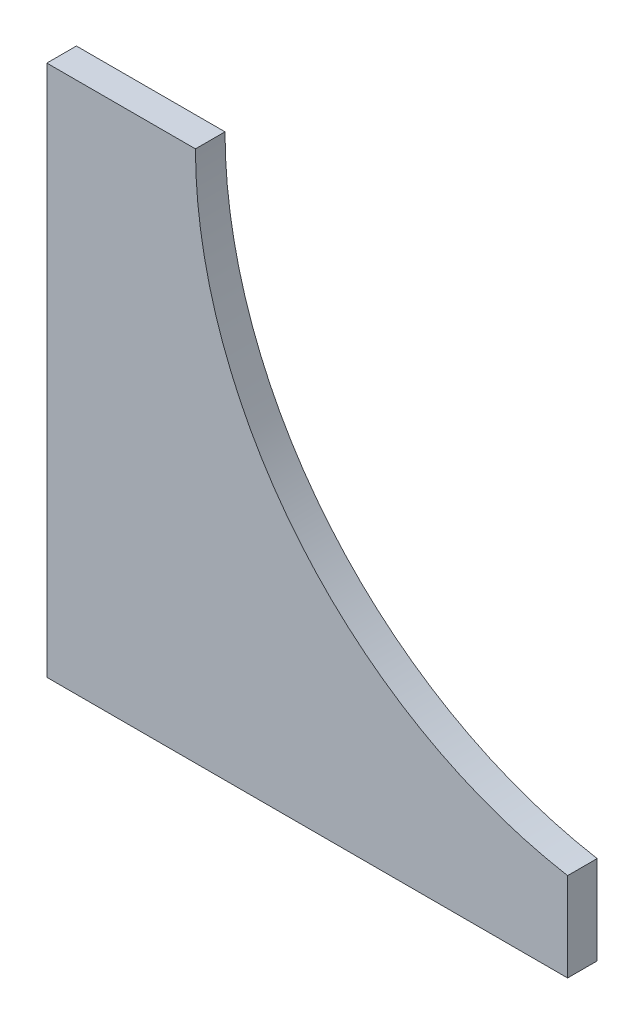
ISO-10303-21;
HEADER;
FILE_DESCRIPTION(('STEP AP214'),'2;1');
FILE_NAME('part.step','',(''),(''),'','','');
FILE_SCHEMA(('AUTOMOTIVE_DESIGN { 1 0 10303 214 1 1 1 1 }'));
ENDSEC;
DATA;
#1=APPLICATION_CONTEXT('core data for automotive mechanical design processes');
#2=APPLICATION_PROTOCOL_DEFINITION('international standard','automotive_design',2000,#1);
#3=PRODUCT_CONTEXT('',#1,'mechanical');
#4=PRODUCT('Part','Part','',(#3));
#5=PRODUCT_RELATED_PRODUCT_CATEGORY('part','',(#4));
#6=PRODUCT_DEFINITION_FORMATION('','',#4);
#7=PRODUCT_DEFINITION_CONTEXT('part definition',#1,'design');
#8=PRODUCT_DEFINITION('design','',#6,#7);
#9=PRODUCT_DEFINITION_SHAPE('','',#8);
#10=(LENGTH_UNIT() NAMED_UNIT(*) SI_UNIT(.MILLI.,.METRE.));
#11=(NAMED_UNIT(*) PLANE_ANGLE_UNIT() SI_UNIT($,.RADIAN.));
#12=(NAMED_UNIT(*) SI_UNIT($,.STERADIAN.) SOLID_ANGLE_UNIT());
#13=UNCERTAINTY_MEASURE_WITH_UNIT(LENGTH_MEASURE(1.E-05),#10,'distance_accuracy_value','');
#14=(GEOMETRIC_REPRESENTATION_CONTEXT(3) GLOBAL_UNCERTAINTY_ASSIGNED_CONTEXT((#13)) GLOBAL_UNIT_ASSIGNED_CONTEXT((#10,
#11,#12)) REPRESENTATION_CONTEXT('',''));
#15=CARTESIAN_POINT('',(0.,0.,0.));
#16=DIRECTION('',(0.,0.,1.));
#17=DIRECTION('',(1.,0.,0.));
#18=AXIS2_PLACEMENT_3D('',#15,#16,#17);
#19=CARTESIAN_POINT('',(-56.2876791796381,206.147542534489,10.));
#20=DIRECTION('',(0.,-1.,0.));
#21=DIRECTION('',(0.,0.,-1.));
#22=AXIS2_PLACEMENT_3D('',#19,#20,#21);
#23=PLANE('',#22);
#24=DIRECTION('',(-1.,0.,0.));
#25=VECTOR('',#24,1.);
#26=CARTESIAN_POINT('',(-56.2876791796381,206.147542534489,0.));
#27=LINE('',#26,#25);
#28=CARTESIAN_POINT('',(-6.00316672651846,206.147542534489,0.));
#29=VERTEX_POINT('',#28);
#30=CARTESIAN_POINT('',(-56.2876791796381,206.147542534489,0.));
#31=VERTEX_POINT('',#30);
#32=EDGE_CURVE('E107',#29,#31,#27,.T.);
#33=ORIENTED_EDGE('',*,*,#32,.T.);
#34=DIRECTION('',(0.,0.,-1.));
#35=VECTOR('',#34,1.);
#36=CARTESIAN_POINT('',(-56.2876791796381,206.147542534489,10.));
#37=LINE('',#36,#35);
#38=CARTESIAN_POINT('',(-56.2876791796381,206.147542534489,10.));
#39=VERTEX_POINT('',#38);
#40=EDGE_CURVE('E11',#39,#31,#37,.T.);
#41=ORIENTED_EDGE('',*,*,#40,.F.);
#42=DIRECTION('',(-1.,0.,0.));
#43=VECTOR('',#42,1.);
#44=CARTESIAN_POINT('',(-56.2876791796381,206.147542534489,10.));
#45=LINE('',#44,#43);
#46=CARTESIAN_POINT('',(-6.00316672651846,206.147542534489,10.));
#47=VERTEX_POINT('',#46);
#48=EDGE_CURVE('E115',#47,#39,#45,.T.);
#49=ORIENTED_EDGE('',*,*,#48,.F.);
#50=DIRECTION('',(0.,0.,-1.));
#51=VECTOR('',#50,1.);
#52=CARTESIAN_POINT('',(-6.00316672651846,206.147542534489,10.));
#53=LINE('',#52,#51);
#54=EDGE_CURVE('E103',#47,#29,#53,.T.);
#55=ORIENTED_EDGE('',*,*,#54,.T.);
#56=EDGE_LOOP('',(#33,#41,#49,#55));
#57=FACE_BOUND('',#56,.T.);
#58=ADVANCED_FACE('F33',(#57),#23,.F.);
#59=CARTESIAN_POINT('',(-56.2876791796381,206.147542534489,10.));
#60=DIRECTION('',(1.,0.,0.));
#61=DIRECTION('',(0.,1.,0.));
#62=AXIS2_PLACEMENT_3D('',#59,#60,#61);
#63=PLANE('',#62);
#64=DIRECTION('',(0.,-1.,0.));
#65=VECTOR('',#64,1.);
#66=CARTESIAN_POINT('',(-56.2876791796381,206.147542534489,0.));
#67=LINE('',#66,#65);
#68=CARTESIAN_POINT('',(-56.2876791796381,26.1475425344888,0.));
#69=VERTEX_POINT('',#68);
#70=EDGE_CURVE('E110',#31,#69,#67,.T.);
#71=ORIENTED_EDGE('',*,*,#70,.T.);
#72=DIRECTION('',(0.,0.,-1.));
#73=VECTOR('',#72,1.);
#74=CARTESIAN_POINT('',(-56.2876791796381,26.1475425344888,10.));
#75=LINE('',#74,#73);
#76=CARTESIAN_POINT('',(-56.2876791796381,26.1475425344888,10.));
#77=VERTEX_POINT('',#76);
#78=EDGE_CURVE('E41',#77,#69,#75,.T.);
#79=ORIENTED_EDGE('',*,*,#78,.F.);
#80=DIRECTION('',(0.,-1.,0.));
#81=VECTOR('',#80,1.);
#82=CARTESIAN_POINT('',(-56.2876791796381,206.147542534489,10.));
#83=LINE('',#82,#81);
#84=EDGE_CURVE('E83',#39,#77,#83,.T.);
#85=ORIENTED_EDGE('',*,*,#84,.F.);
#86=ORIENTED_EDGE('',*,*,#40,.T.);
#87=EDGE_LOOP('',(#71,#79,#85,#86));
#88=FACE_BOUND('',#87,.T.);
#89=ADVANCED_FACE('F134',(#88),#63,.F.);
#90=CARTESIAN_POINT('',(-56.2876791796381,26.1475425344888,10.));
#91=DIRECTION('',(0.,1.,0.));
#92=DIRECTION('',(0.,0.,1.));
#93=AXIS2_PLACEMENT_3D('',#90,#91,#92);
#94=PLANE('',#93);
#95=DIRECTION('',(1.,0.,0.));
#96=VECTOR('',#95,1.);
#97=CARTESIAN_POINT('',(-56.2876791796381,26.1475425344888,0.));
#98=LINE('',#97,#96);
#99=CARTESIAN_POINT('',(119.918563854883,26.1475425344888,0.));
#100=VERTEX_POINT('',#99);
#101=EDGE_CURVE('E98',#69,#100,#98,.T.);
#102=ORIENTED_EDGE('',*,*,#101,.T.);
#103=DIRECTION('',(0.,0.,-1.));
#104=VECTOR('',#103,1.);
#105=CARTESIAN_POINT('',(119.918563854883,26.1475425344888,10.));
#106=LINE('',#105,#104);
#107=CARTESIAN_POINT('',(119.918563854883,26.1475425344888,10.));
#108=VERTEX_POINT('',#107);
#109=EDGE_CURVE('E95',#108,#100,#106,.T.);
#110=ORIENTED_EDGE('',*,*,#109,.F.);
#111=DIRECTION('',(1.,0.,0.));
#112=VECTOR('',#111,1.);
#113=CARTESIAN_POINT('',(-56.2876791796381,26.1475425344888,10.));
#114=LINE('',#113,#112);
#115=EDGE_CURVE('E87',#77,#108,#114,.T.);
#116=ORIENTED_EDGE('',*,*,#115,.F.);
#117=ORIENTED_EDGE('',*,*,#78,.T.);
#118=EDGE_LOOP('',(#102,#110,#116,#117));
#119=FACE_BOUND('',#118,.T.);
#120=ADVANCED_FACE('F96',(#119),#94,.F.);
#121=CARTESIAN_POINT('',(119.918563854883,26.1475425344888,10.));
#122=DIRECTION('',(-1.,0.,0.));
#123=DIRECTION('',(0.,0.,1.));
#124=AXIS2_PLACEMENT_3D('',#121,#122,#123);
#125=PLANE('',#124);
#126=DIRECTION('',(0.,1.,0.));
#127=VECTOR('',#126,1.);
#128=CARTESIAN_POINT('',(119.918563854883,26.1475425344888,0.));
#129=LINE('',#128,#127);
#130=CARTESIAN_POINT('',(119.918563854883,56.1475425344888,0.));
#131=VERTEX_POINT('',#130);
#132=EDGE_CURVE('E69',#100,#131,#129,.T.);
#133=ORIENTED_EDGE('',*,*,#132,.T.);
#134=DIRECTION('',(0.,0.,-1.));
#135=VECTOR('',#134,1.);
#136=CARTESIAN_POINT('',(119.918563854883,56.1475425344888,10.));
#137=LINE('',#136,#135);
#138=CARTESIAN_POINT('',(119.918563854883,56.1475425344888,10.));
#139=VERTEX_POINT('',#138);
#140=EDGE_CURVE('E99',#139,#131,#137,.T.);
#141=ORIENTED_EDGE('',*,*,#140,.F.);
#142=DIRECTION('',(0.,1.,0.));
#143=VECTOR('',#142,1.);
#144=CARTESIAN_POINT('',(119.918563854883,26.1475425344888,10.));
#145=LINE('',#144,#143);
#146=EDGE_CURVE('E91',#108,#139,#145,.T.);
#147=ORIENTED_EDGE('',*,*,#146,.F.);
#148=ORIENTED_EDGE('',*,*,#109,.T.);
#149=EDGE_LOOP('',(#133,#141,#147,#148));
#150=FACE_BOUND('',#149,.T.);
#151=ADVANCED_FACE('F101',(#150),#125,.F.);
#152=CARTESIAN_POINT('',(146.298910347541,206.147542534489,10.));
#153=DIRECTION('',(0.,0.,-1.));
#154=DIRECTION('',(-1.,0.,0.));
#155=AXIS2_PLACEMENT_3D('',#152,#153,#154);
#156=CYLINDRICAL_SURFACE('',#155,152.302077074059);
#157=CARTESIAN_POINT('',(146.298910347541,206.147542534489,0.));
#158=DIRECTION('',(0.,0.,-1.));
#159=DIRECTION('',(1.,0.,0.));
#160=AXIS2_PLACEMENT_3D('',#157,#158,#159);
#161=CIRCLE('',#160,152.302077074059);
#162=EDGE_CURVE('E75',#131,#29,#161,.T.);
#163=ORIENTED_EDGE('',*,*,#162,.T.);
#164=ORIENTED_EDGE('',*,*,#54,.F.);
#165=CARTESIAN_POINT('',(146.298910347541,206.147542534489,10.));
#166=DIRECTION('',(0.,0.,-1.));
#167=DIRECTION('',(1.,0.,0.));
#168=AXIS2_PLACEMENT_3D('',#165,#166,#167);
#169=CIRCLE('',#168,152.302077074059);
#170=EDGE_CURVE('E49',#139,#47,#169,.T.);
#171=ORIENTED_EDGE('',*,*,#170,.F.);
#172=ORIENTED_EDGE('',*,*,#140,.T.);
#173=EDGE_LOOP('',(#163,#164,#171,#172));
#174=FACE_BOUND('',#173,.T.);
#175=ADVANCED_FACE('F123',(#174),#156,.F.);
#176=CARTESIAN_POINT('',(146.298910347541,206.147542534489,10.));
#177=DIRECTION('',(0.,0.,1.));
#178=DIRECTION('',(1.,0.,0.));
#179=AXIS2_PLACEMENT_3D('',#176,#177,#178);
#180=PLANE('',#179);
#181=ORIENTED_EDGE('',*,*,#48,.T.);
#182=ORIENTED_EDGE('',*,*,#84,.T.);
#183=ORIENTED_EDGE('',*,*,#115,.T.);
#184=ORIENTED_EDGE('',*,*,#146,.T.);
#185=ORIENTED_EDGE('',*,*,#170,.T.);
#186=EDGE_LOOP('',(#181,#182,#183,#184,#185));
#187=FACE_BOUND('',#186,.T.);
#188=ADVANCED_FACE('F89',(#187),#180,.T.);
#189=CARTESIAN_POINT('',(146.298910347541,206.147542534489,0.));
#190=DIRECTION('',(0.,0.,1.));
#191=DIRECTION('',(1.,0.,0.));
#192=AXIS2_PLACEMENT_3D('',#189,#190,#191);
#193=PLANE('',#192);
#194=ORIENTED_EDGE('',*,*,#32,.F.);
#195=ORIENTED_EDGE('',*,*,#162,.F.);
#196=ORIENTED_EDGE('',*,*,#132,.F.);
#197=ORIENTED_EDGE('',*,*,#101,.F.);
#198=ORIENTED_EDGE('',*,*,#70,.F.);
#199=EDGE_LOOP('',(#194,#195,#196,#197,#198));
#200=FACE_BOUND('',#199,.T.);
#201=ADVANCED_FACE('F119',(#200),#193,.F.);
#202=CLOSED_SHELL('',(#58,#89,#120,#151,#175,#188,#201));
#203=MANIFOLD_SOLID_BREP('B2',#202);
#204=ADVANCED_BREP_SHAPE_REPRESENTATION('',(#18,#203),#14);
#205=SHAPE_DEFINITION_REPRESENTATION(#9,#204);
ENDSEC;
END-ISO-10303-21;
